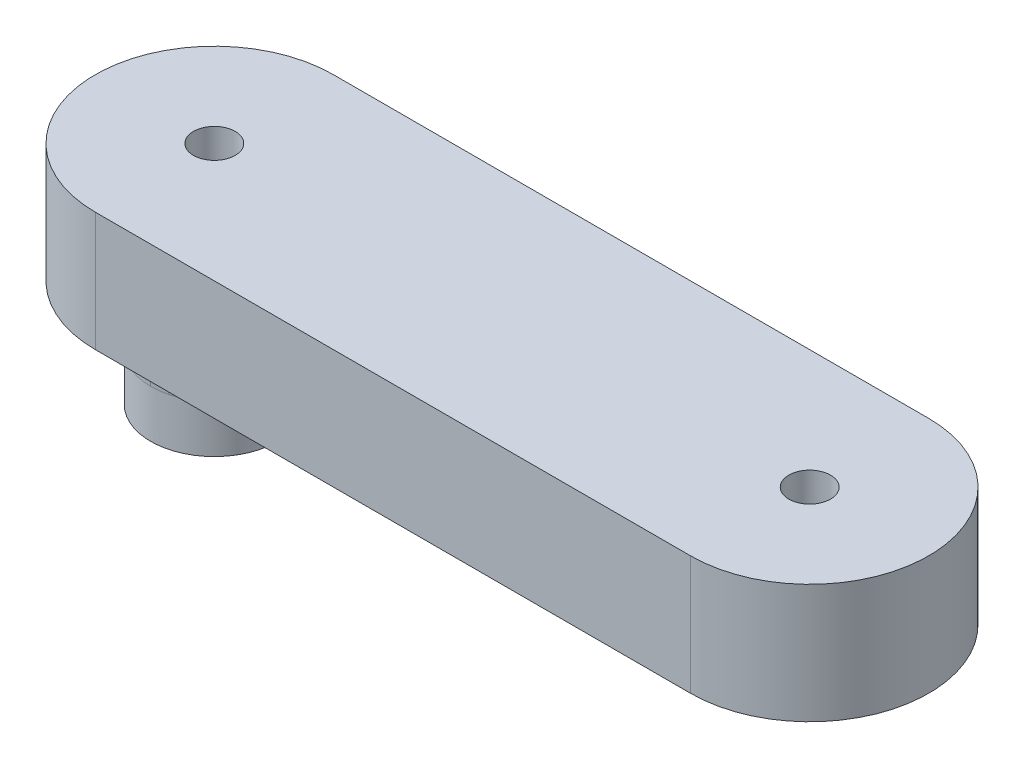
ISO-10303-21;
HEADER;
FILE_DESCRIPTION(('STEP AP214'),'2;1');
FILE_NAME('part.step','',(''),(''),'','','');
FILE_SCHEMA(('AUTOMOTIVE_DESIGN { 1 0 10303 214 1 1 1 1 }'));
ENDSEC;
DATA;
#1=APPLICATION_CONTEXT('core data for automotive mechanical design processes');
#2=APPLICATION_PROTOCOL_DEFINITION('international standard','automotive_design',2000,#1);
#3=PRODUCT_CONTEXT('',#1,'mechanical');
#4=PRODUCT('Part','Part','',(#3));
#5=PRODUCT_RELATED_PRODUCT_CATEGORY('part','',(#4));
#6=PRODUCT_DEFINITION_FORMATION('','',#4);
#7=PRODUCT_DEFINITION_CONTEXT('part definition',#1,'design');
#8=PRODUCT_DEFINITION('design','',#6,#7);
#9=PRODUCT_DEFINITION_SHAPE('','',#8);
#10=(LENGTH_UNIT() NAMED_UNIT(*) SI_UNIT(.MILLI.,.METRE.));
#11=(NAMED_UNIT(*) PLANE_ANGLE_UNIT() SI_UNIT($,.RADIAN.));
#12=(NAMED_UNIT(*) SI_UNIT($,.STERADIAN.) SOLID_ANGLE_UNIT());
#13=UNCERTAINTY_MEASURE_WITH_UNIT(LENGTH_MEASURE(1.E-05),#10,'distance_accuracy_value','');
#14=(GEOMETRIC_REPRESENTATION_CONTEXT(3) GLOBAL_UNCERTAINTY_ASSIGNED_CONTEXT((#13)) GLOBAL_UNIT_ASSIGNED_CONTEXT((#10,
#11,#12)) REPRESENTATION_CONTEXT('',''));
#15=CARTESIAN_POINT('',(0.,0.,0.));
#16=DIRECTION('',(0.,0.,1.));
#17=DIRECTION('',(1.,0.,0.));
#18=AXIS2_PLACEMENT_3D('',#15,#16,#17);
#19=CARTESIAN_POINT('',(-25.,10.,0.));
#20=DIRECTION('',(0.,-1.,0.));
#21=DIRECTION('',(0.,0.,-1.));
#22=AXIS2_PLACEMENT_3D('',#19,#20,#21);
#23=CYLINDRICAL_SURFACE('',#22,10.);
#24=CARTESIAN_POINT('',(-25.,0.,0.));
#25=DIRECTION('',(0.,1.,0.));
#26=DIRECTION('',(0.,0.,1.));
#27=AXIS2_PLACEMENT_3D('',#24,#25,#26);
#28=CIRCLE('',#27,10.);
#29=CARTESIAN_POINT('',(-25.,0.,-10.));
#30=VERTEX_POINT('',#29);
#31=CARTESIAN_POINT('',(-25.,0.,10.));
#32=VERTEX_POINT('',#31);
#33=EDGE_CURVE('E141',#30,#32,#28,.T.);
#34=ORIENTED_EDGE('',*,*,#33,.T.);
#35=DIRECTION('',(0.,-1.,0.));
#36=VECTOR('',#35,1.);
#37=CARTESIAN_POINT('',(-25.,10.,10.));
#38=LINE('',#37,#36);
#39=CARTESIAN_POINT('',(-25.,10.,10.));
#40=VERTEX_POINT('',#39);
#41=EDGE_CURVE('E120',#40,#32,#38,.T.);
#42=ORIENTED_EDGE('',*,*,#41,.F.);
#43=CARTESIAN_POINT('',(-25.,10.,0.));
#44=DIRECTION('',(0.,1.,0.));
#45=DIRECTION('',(0.,0.,1.));
#46=AXIS2_PLACEMENT_3D('',#43,#44,#45);
#47=CIRCLE('',#46,10.);
#48=CARTESIAN_POINT('',(-25.,10.,-10.));
#49=VERTEX_POINT('',#48);
#50=EDGE_CURVE('E128',#49,#40,#47,.T.);
#51=ORIENTED_EDGE('',*,*,#50,.F.);
#52=DIRECTION('',(0.,-1.,0.));
#53=VECTOR('',#52,1.);
#54=CARTESIAN_POINT('',(-25.,10.,-10.));
#55=LINE('',#54,#53);
#56=EDGE_CURVE('E254',#49,#30,#55,.T.);
#57=ORIENTED_EDGE('',*,*,#56,.T.);
#58=EDGE_LOOP('',(#34,#42,#51,#57));
#59=FACE_BOUND('',#58,.T.);
#60=ADVANCED_FACE('F49',(#59),#23,.T.);
#61=CARTESIAN_POINT('',(-25.,10.,10.));
#62=DIRECTION('',(0.,0.,-1.));
#63=DIRECTION('',(-1.,0.,0.));
#64=AXIS2_PLACEMENT_3D('',#61,#62,#63);
#65=PLANE('',#64);
#66=DIRECTION('',(1.,0.,0.));
#67=VECTOR('',#66,1.);
#68=CARTESIAN_POINT('',(-25.,0.,10.));
#69=LINE('',#68,#67);
#70=CARTESIAN_POINT('',(-22.3311987709835,0.,10.));
#71=VERTEX_POINT('',#70);
#72=EDGE_CURVE('E250',#32,#71,#69,.T.);
#73=ORIENTED_EDGE('',*,*,#72,.T.);
#74=CARTESIAN_POINT('',(25.,0.,9.99999999999999));
#75=VERTEX_POINT('',#74);
#76=EDGE_CURVE('E268',#71,#75,#69,.T.);
#77=ORIENTED_EDGE('',*,*,#76,.T.);
#78=DIRECTION('',(0.,-1.,0.));
#79=VECTOR('',#78,1.);
#80=CARTESIAN_POINT('',(25.,10.,9.99999999999999));
#81=LINE('',#80,#79);
#82=CARTESIAN_POINT('',(25.,10.,9.99999999999999));
#83=VERTEX_POINT('',#82);
#84=EDGE_CURVE('E123',#83,#75,#81,.T.);
#85=ORIENTED_EDGE('',*,*,#84,.F.);
#86=DIRECTION('',(1.,0.,0.));
#87=VECTOR('',#86,1.);
#88=CARTESIAN_POINT('',(-25.,10.,10.));
#89=LINE('',#88,#87);
#90=EDGE_CURVE('E115',#40,#83,#89,.T.);
#91=ORIENTED_EDGE('',*,*,#90,.F.);
#92=ORIENTED_EDGE('',*,*,#41,.T.);
#93=EDGE_LOOP('',(#73,#77,#85,#91,#92));
#94=FACE_BOUND('',#93,.T.);
#95=ADVANCED_FACE('F118',(#94),#65,.F.);
#96=CARTESIAN_POINT('',(25.,10.,0.));
#97=DIRECTION('',(0.,-1.,0.));
#98=DIRECTION('',(0.,0.,-1.));
#99=AXIS2_PLACEMENT_3D('',#96,#97,#98);
#100=CYLINDRICAL_SURFACE('',#99,10.);
#101=CARTESIAN_POINT('',(25.,0.,0.));
#102=DIRECTION('',(0.,1.,0.));
#103=DIRECTION('',(0.,0.,1.));
#104=AXIS2_PLACEMENT_3D('',#101,#102,#103);
#105=CIRCLE('',#104,10.);
#106=CARTESIAN_POINT('',(25.,0.,-10.));
#107=VERTEX_POINT('',#106);
#108=EDGE_CURVE('E246',#75,#107,#105,.T.);
#109=ORIENTED_EDGE('',*,*,#108,.T.);
#110=DIRECTION('',(0.,-1.,0.));
#111=VECTOR('',#110,1.);
#112=CARTESIAN_POINT('',(25.,10.,-10.));
#113=LINE('',#112,#111);
#114=CARTESIAN_POINT('',(25.,10.,-10.));
#115=VERTEX_POINT('',#114);
#116=EDGE_CURVE('E149',#115,#107,#113,.T.);
#117=ORIENTED_EDGE('',*,*,#116,.F.);
#118=CARTESIAN_POINT('',(25.,10.,0.));
#119=DIRECTION('',(0.,1.,0.));
#120=DIRECTION('',(0.,0.,1.));
#121=AXIS2_PLACEMENT_3D('',#118,#119,#120);
#122=CIRCLE('',#121,10.);
#123=EDGE_CURVE('E127',#83,#115,#122,.T.);
#124=ORIENTED_EDGE('',*,*,#123,.F.);
#125=ORIENTED_EDGE('',*,*,#84,.T.);
#126=EDGE_LOOP('',(#109,#117,#124,#125));
#127=FACE_BOUND('',#126,.T.);
#128=ADVANCED_FACE('F232',(#127),#100,.T.);
#129=CARTESIAN_POINT('',(-25.,10.,-10.));
#130=DIRECTION('',(0.,0.,1.));
#131=DIRECTION('',(1.,0.,0.));
#132=AXIS2_PLACEMENT_3D('',#129,#130,#131);
#133=PLANE('',#132);
#134=DIRECTION('',(-1.,0.,0.));
#135=VECTOR('',#134,1.);
#136=CARTESIAN_POINT('',(-25.,0.,-10.));
#137=LINE('',#136,#135);
#138=CARTESIAN_POINT('',(-22.3311987709835,0.,-10.));
#139=VERTEX_POINT('',#138);
#140=EDGE_CURVE('E138',#107,#139,#137,.T.);
#141=ORIENTED_EDGE('',*,*,#140,.T.);
#142=EDGE_CURVE('E249',#139,#30,#137,.T.);
#143=ORIENTED_EDGE('',*,*,#142,.T.);
#144=ORIENTED_EDGE('',*,*,#56,.F.);
#145=DIRECTION('',(-1.,0.,0.));
#146=VECTOR('',#145,1.);
#147=CARTESIAN_POINT('',(-25.,10.,-10.));
#148=LINE('',#147,#146);
#149=EDGE_CURVE('E133',#115,#49,#148,.T.);
#150=ORIENTED_EDGE('',*,*,#149,.F.);
#151=ORIENTED_EDGE('',*,*,#116,.T.);
#152=EDGE_LOOP('',(#141,#143,#144,#150,#151));
#153=FACE_BOUND('',#152,.T.);
#154=ADVANCED_FACE('F190',(#153),#133,.F.);
#155=CARTESIAN_POINT('',(-25.,10.,0.));
#156=DIRECTION('',(0.,1.,0.));
#157=DIRECTION('',(0.,0.,1.));
#158=AXIS2_PLACEMENT_3D('',#155,#156,#157);
#159=PLANE('',#158);
#160=CARTESIAN_POINT('',(-25.,10.,0.));
#161=DIRECTION('',(0.,1.,0.));
#162=DIRECTION('',(0.,0.,1.));
#163=AXIS2_PLACEMENT_3D('',#160,#161,#162);
#164=CIRCLE('',#163,1.75);
#165=CARTESIAN_POINT('',(-25.,10.,1.75));
#166=VERTEX_POINT('',#165);
#167=EDGE_CURVE('E290',#166,#166,#164,.F.);
#168=ORIENTED_EDGE('',*,*,#167,.T.);
#169=EDGE_LOOP('',(#168));
#170=FACE_BOUND('',#169,.T.);
#171=CARTESIAN_POINT('',(25.,10.,0.));
#172=DIRECTION('',(0.,1.,0.));
#173=DIRECTION('',(0.,0.,1.));
#174=AXIS2_PLACEMENT_3D('',#171,#172,#173);
#175=CIRCLE('',#174,1.75);
#176=CARTESIAN_POINT('',(25.,10.,1.74999999999999));
#177=VERTEX_POINT('',#176);
#178=EDGE_CURVE('E275',#177,#177,#175,.T.);
#179=ORIENTED_EDGE('',*,*,#178,.F.);
#180=EDGE_LOOP('',(#179));
#181=FACE_BOUND('',#180,.T.);
#182=ORIENTED_EDGE('',*,*,#50,.T.);
#183=ORIENTED_EDGE('',*,*,#90,.T.);
#184=ORIENTED_EDGE('',*,*,#123,.T.);
#185=ORIENTED_EDGE('',*,*,#149,.T.);
#186=EDGE_LOOP('',(#182,#183,#184,#185));
#187=FACE_BOUND('',#186,.T.);
#188=ADVANCED_FACE('F131',(#170,#181,#187),#159,.T.);
#189=CARTESIAN_POINT('',(-25.,0.,0.));
#190=DIRECTION('',(0.,1.,0.));
#191=DIRECTION('',(0.,0.,1.));
#192=AXIS2_PLACEMENT_3D('',#189,#190,#191);
#193=PLANE('',#192);
#194=CARTESIAN_POINT('',(25.,0.,0.));
#195=DIRECTION('',(0.,1.,0.));
#196=DIRECTION('',(0.,0.,1.));
#197=AXIS2_PLACEMENT_3D('',#194,#195,#196);
#198=CIRCLE('',#197,1.75);
#199=CARTESIAN_POINT('',(25.,0.,1.74999999999999));
#200=VERTEX_POINT('',#199);
#201=EDGE_CURVE('E269',#200,#200,#198,.F.);
#202=ORIENTED_EDGE('',*,*,#201,.F.);
#203=EDGE_LOOP('',(#202));
#204=FACE_BOUND('',#203,.T.);
#205=ORIENTED_EDGE('',*,*,#76,.F.);
#206=CARTESIAN_POINT('',(-25.,0.,0.));
#207=DIRECTION('',(0.,1.,0.));
#208=DIRECTION('',(0.,0.,1.));
#209=AXIS2_PLACEMENT_3D('',#206,#207,#208);
#210=CIRCLE('',#209,10.35);
#211=EDGE_CURVE('E11',#71,#139,#210,.T.);
#212=ORIENTED_EDGE('',*,*,#211,.T.);
#213=ORIENTED_EDGE('',*,*,#140,.F.);
#214=ORIENTED_EDGE('',*,*,#108,.F.);
#215=EDGE_LOOP('',(#205,#212,#213,#214));
#216=FACE_BOUND('',#215,.T.);
#217=ADVANCED_FACE('F187',(#204,#216),#193,.F.);
#218=CARTESIAN_POINT('',(25.,-0.000999999999999265,0.));
#219=DIRECTION('',(0.,1.,0.));
#220=DIRECTION('',(0.,0.,1.));
#221=AXIS2_PLACEMENT_3D('',#218,#219,#220);
#222=CYLINDRICAL_SURFACE('',#221,1.75);
#223=ORIENTED_EDGE('',*,*,#178,.T.);
#224=EDGE_LOOP('',(#223));
#225=FACE_BOUND('',#224,.T.);
#226=ORIENTED_EDGE('',*,*,#201,.T.);
#227=EDGE_LOOP('',(#226));
#228=FACE_BOUND('',#227,.T.);
#229=ADVANCED_FACE('F308',(#225,#228),#222,.F.);
#230=CARTESIAN_POINT('',(-25.,-9.,0.));
#231=DIRECTION('',(0.,1.,0.));
#232=DIRECTION('',(0.,0.,1.));
#233=AXIS2_PLACEMENT_3D('',#230,#231,#232);
#234=CYLINDRICAL_SURFACE('',#233,5.35);
#235=CARTESIAN_POINT('',(-25.,-5.,0.));
#236=DIRECTION('',(0.,1.,0.));
#237=DIRECTION('',(0.,0.,1.));
#238=AXIS2_PLACEMENT_3D('',#235,#236,#237);
#239=CIRCLE('',#238,5.35);
#240=CARTESIAN_POINT('',(-23.6204747270301,-5.,-5.16908212560387));
#241=VERTEX_POINT('',#240);
#242=CARTESIAN_POINT('',(-23.6204747270301,-5.,5.16908212560387));
#243=VERTEX_POINT('',#242);
#244=EDGE_CURVE('E143',#241,#243,#239,.F.);
#245=ORIENTED_EDGE('',*,*,#244,.T.);
#246=CARTESIAN_POINT('',(-22.4063247817949,-4.90937934062816,4.67924661270043));
#247=CARTESIAN_POINT('',(-22.8879748506339,0.975498043250479,4.94622203647995));
#248=CARTESIAN_POINT('',(-19.982329250762,0.,10.));
#249=CARTESIAN_POINT('',(-22.468087902895,-4.92215702125141,4.7134828290892));
#250=CARTESIAN_POINT('',(-22.9020255513305,0.90527144246055,4.9457728156593));
#251=CARTESIAN_POINT('',(-20.1018149149591,0.,10.));
#252=CARTESIAN_POINT('',(-22.5305936384705,-4.93311468699,4.74652914754896));
#253=CARTESIAN_POINT('',(-22.9210674061778,0.837164866416158,4.94901573193148));
#254=CARTESIAN_POINT('',(-20.2227372258345,0.,10.));
#255=CARTESIAN_POINT('',(-22.6569545492993,-4.95194389528001,4.81016000486057));
#256=CARTESIAN_POINT('',(-22.9683167428165,0.706727456995853,4.96116416599632));
#257=CARTESIAN_POINT('',(-20.4671924458317,0.,10.));
#258=CARTESIAN_POINT('',(-22.7208094807857,-4.95981599037782,4.84074498369482));
#259=CARTESIAN_POINT('',(-22.996430695619,0.644290788526217,4.97000691203827));
#260=CARTESIAN_POINT('',(-20.5907248833673,0.,10.));
#261=CARTESIAN_POINT('',(-22.914101894452,-4.9796272877734,4.92864537441296));
#262=CARTESIAN_POINT('',(-23.0928174155575,0.467291109513011,5.00221179667532));
#263=CARTESIAN_POINT('',(-20.9646644125965,0.,10.));
#264=CARTESIAN_POINT('',(-23.045388346509,-4.9877843263485,4.98217352822328));
#265=CARTESIAN_POINT('',(-23.1738131629906,0.36035783012853,5.03140402812189));
#266=CARTESIAN_POINT('',(-21.218648483424,0.,10.));
#267=CARTESIAN_POINT('',(-23.3085469853189,-4.99768796878871,5.07745985956556));
#268=CARTESIAN_POINT('',(-23.3603007018644,0.174145036372328,5.09358181809736));
#269=CARTESIAN_POINT('',(-21.7277497753456,0.,10.));
#270=CARTESIAN_POINT('',(-23.4403256872486,-4.99958701406536,5.11947470033271));
#271=CARTESIAN_POINT('',(-23.4649516265539,0.0935749025152531,5.1264658155242));
#272=CARTESIAN_POINT('',(-21.9826861426236,0.,10.));
#273=CARTESIAN_POINT('',(-23.7067656944101,-5.00029124399043,5.19318317312786));
#274=CARTESIAN_POINT('',(-23.6933077655576,-0.0448370798064056,5.18928403448164));
#275=CARTESIAN_POINT('',(-22.4981355022677,0.,10.));
#276=CARTESIAN_POINT('',(-23.8414274910527,-4.99909589698226,5.22487503048074));
#277=CARTESIAN_POINT('',(-23.8171590642594,-0.103227899936856,5.21936847159637));
#278=CARTESIAN_POINT('',(-22.7586494453069,0.,10.));
#279=CARTESIAN_POINT('',(-24.1153230647331,-4.99581213660066,5.27822633599849));
#280=CARTESIAN_POINT('',(-24.0802845511431,-0.199835553334219,5.27218728131988));
#281=CARTESIAN_POINT('',(-23.2885221906525,0.,10.));
#282=CARTESIAN_POINT('',(-24.2545952926233,-4.99370752498329,5.29968820730515));
#283=CARTESIAN_POINT('',(-24.2202075943135,-0.238070156897069,5.29496276846834));
#284=CARTESIAN_POINT('',(-23.5579553791874,0.,10.));
#285=CARTESIAN_POINT('',(-24.5343909129845,-4.99020537825828,5.33156033600395));
#286=CARTESIAN_POINT('',(-24.5075631984335,-0.294212329057783,5.3293078754699));
#287=CARTESIAN_POINT('',(-24.0992422335306,0.,10.));
#288=CARTESIAN_POINT('',(-24.6749142592356,-4.98880781713959,5.34197099996452));
#289=CARTESIAN_POINT('',(-24.6555353138538,-0.312355351759313,5.34101420045178));
#290=CARTESIAN_POINT('',(-24.371095809923,0.,10.));
#291=CARTESIAN_POINT('',(-24.9599527315156,-4.98750073565178,5.35179776405821));
#292=CARTESIAN_POINT('',(-24.9571017441589,-0.329418746312639,5.35199488366776));
#293=CARTESIAN_POINT('',(-24.9225253777918,0.,10.));
#294=CARTESIAN_POINT('',(-25.1044783247979,-4.98763004344253,5.35092692281945));
#295=CARTESIAN_POINT('',(-25.111405781805,-0.327912126433172,5.35099298670278));
#296=CARTESIAN_POINT('',(-25.2021216190016,0.,10.));
#297=CARTESIAN_POINT('',(-25.320833368275,-4.98894637096785,5.340860003256));
#298=CARTESIAN_POINT('',(-25.3396172782977,-0.310420525479363,5.33979122345231));
#299=CARTESIAN_POINT('',(-25.620677637691,0.,10.));
#300=CARTESIAN_POINT('',(-25.3928925362841,-4.98957242342615,5.33604258314774));
#301=CARTESIAN_POINT('',(-25.4153552384296,-0.302025929414769,5.33442455139388));
#302=CARTESIAN_POINT('',(-25.7600818225309,0.,10.));
#303=CARTESIAN_POINT('',(-25.5367558026473,-4.99108186619892,5.32349558536303));
#304=CARTESIAN_POINT('',(-25.5651430873869,-0.280067579465135,5.3206780454283));
#305=CARTESIAN_POINT('',(-26.0383967397009,0.,10.));
#306=CARTESIAN_POINT('',(-25.6085599023708,-4.99196525512985,5.31576602334332));
#307=CARTESIAN_POINT('',(-25.6392701624221,-0.266479800947126,5.31228369439717));
#308=CARTESIAN_POINT('',(-26.1773074746799,0.,10.));
#309=CARTESIAN_POINT('',(-25.6801859681807,-4.99291881518917,5.3065852531256));
#310=CARTESIAN_POINT('',(-25.7120499996823,-0.250271465370146,5.30250099440117));
#311=CARTESIAN_POINT('',(-26.3158737889103,0.,10.));
#312=(BOUNDED_SURFACE() B_SPLINE_SURFACE(3,2,((#246,#247,#248),(#249,#250,#251),(#252,#253,
#254),(#255,#256,#257),(#258,#259,#260),(#261,#262,#263),(#264,#265,#266),(#267,#268,#269),
(#270,#271,#272),(#273,#274,#275),(#276,#277,#278),(#279,#280,#281),(#282,#283,#284),(#285,#286,
#287),(#288,#289,#290),(#291,#292,#293),(#294,#295,#296),(#297,#298,#299),(#300,#301,#302),
(#303,#304,#305),(#306,#307,#308),(#309,#310,#311)),.UNSPECIFIED.,.F.,.F.,
.F.) B_SPLINE_SURFACE_WITH_KNOTS((4,2,2,2,2,2,2,2,2,2,4),(3,3),(0.,0.411542741492993,
0.823011752553321,1.645144449525,2.44709631854861,3.24918598240891,4.06619522460137,
4.88317440838842,5.72097312572852,6.14002468851432,6.55907399835985),(0.,1.),
.UNSPECIFIED.) GEOMETRIC_REPRESENTATION_ITEM() RATIONAL_B_SPLINE_SURFACE(((1.,0.645846913338497,
1.),(1.,0.649862634729996,1.),(1.,0.653798780730085,1.),(1.,0.661474206336515,1.),(1.,
0.665213521086353,1.),(1.,0.676074699999644,1.),(1.,0.682847801331046,1.),(1.,0.695078749137499,
1.),(1.,0.700564799930277,1.),(1.,0.710281907038307,1.),(1.,0.714512747553014,1.),(1.,
0.721677506720577,1.),(1.,0.724585837636818,1.),(1.,0.728916944876098,1.),(1.,0.730339775849909,
1.),(1.,0.731682421614335,1.),(1.,0.731563010207267,1.),(1.,0.730188276238598,1.),(1.,
0.72953053405369,1.),(1.,0.727821334129289,1.),(1.,0.726769878506541,1.),(1.,0.725524091352782,1.))) REPRESENTATION_ITEM('') SURFACE());
#313=CARTESIAN_POINT('',(-22.4063247817949,-4.90937934062816,4.67924661270043));
#314=CARTESIAN_POINT('',(-22.468087902895,-4.92215702125141,4.7134828290892));
#315=CARTESIAN_POINT('',(-22.5305936384705,-4.93311468699,4.74652914754896));
#316=CARTESIAN_POINT('',(-22.6569545492993,-4.95194389528001,4.81016000486057));
#317=CARTESIAN_POINT('',(-22.7208094807857,-4.95981599037782,4.84074498369482));
#318=CARTESIAN_POINT('',(-22.914101894452,-4.9796272877734,4.92864537441296));
#319=CARTESIAN_POINT('',(-23.045388346509,-4.9877843263485,4.98217352822328));
#320=CARTESIAN_POINT('',(-23.3085469853189,-4.99768796878871,5.07745985956556));
#321=CARTESIAN_POINT('',(-23.4403256872486,-4.99958701406536,5.11947470033271));
#322=CARTESIAN_POINT('',(-23.7067656944101,-5.00029124399043,5.19318317312786));
#323=CARTESIAN_POINT('',(-23.8414274910527,-4.99909589698226,5.22487503048074));
#324=CARTESIAN_POINT('',(-24.1153230647331,-4.99581213660066,5.27822633599849));
#325=CARTESIAN_POINT('',(-24.2545952926234,-4.99370752498329,5.29968820730515));
#326=CARTESIAN_POINT('',(-24.5343909129845,-4.99020537825828,5.33156033600395));
#327=CARTESIAN_POINT('',(-24.6749142592356,-4.98880781713959,5.34197099996452));
#328=CARTESIAN_POINT('',(-24.9599527315156,-4.98750073565178,5.35179776405821));
#329=CARTESIAN_POINT('',(-25.1044783247979,-4.98763004344254,5.35092692281945));
#330=CARTESIAN_POINT('',(-25.320833368275,-4.98894637096785,5.340860003256));
#331=CARTESIAN_POINT('',(-25.3928925362841,-4.98957242342615,5.33604258314774));
#332=CARTESIAN_POINT('',(-25.5367558026473,-4.99108186619892,5.32349558536303));
#333=CARTESIAN_POINT('',(-25.6085599023708,-4.99196525512985,5.31576602334332));
#334=CARTESIAN_POINT('',(-25.6801859681807,-4.99291881518917,5.3065852531256));
#335=B_SPLINE_CURVE_WITH_KNOTS('',3,(#313,#314,#315,#316,#317,#318,#319,#320,#321,#322,#323,
#324,#325,#326,#327,#328,#329,#330,#331,#332,#333,#334),.UNSPECIFIED.,.F.,.F.,(4,2,2,2,2,2,2,2,
2,2,4),(0.,0.411542741492993,0.823011752553321,1.645144449525,2.44709631854861,3.24918598240891,
4.06619522460137,4.88317440838842,5.72097312572852,6.14002468851432,6.55907399835985),.UNSPECIFIED.);
#336=CARTESIAN_POINT('',(-25.,-4.98773495687171,5.35));
#337=VERTEX_POINT('',#336);
#338=EDGE_CURVE('E63',#243,#337,#335,.T.);
#339=ORIENTED_EDGE('',*,*,#338,.T.);
#340=CARTESIAN_POINT('',(-25.,-4.98773495687171,0.));
#341=DIRECTION('',(0.,1.,0.));
#342=DIRECTION('',(0.,0.,1.));
#343=AXIS2_PLACEMENT_3D('',#340,#341,#342);
#344=CIRCLE('',#343,5.35);
#345=CARTESIAN_POINT('',(-25.,-4.98773495687171,-5.35));
#346=VERTEX_POINT('',#345);
#347=EDGE_CURVE('E161',#337,#346,#344,.F.);
#348=ORIENTED_EDGE('',*,*,#347,.T.);
#349=CARTESIAN_POINT('',(-26.0228866606093,-4.99746914629356,-5.25130487398585));
#350=CARTESIAN_POINT('',(-26.0518342041425,-0.151327584497428,-5.24566626475481));
#351=CARTESIAN_POINT('',(-26.9788555023003,0.,-10.));
#352=CARTESIAN_POINT('',(-25.9519816330296,-4.99661173471191,-5.26511615605325));
#353=CARTESIAN_POINT('',(-25.9838925193806,-0.176275219698127,-5.25932344975122));
#354=CARTESIAN_POINT('',(-26.8416840938048,0.,-10.));
#355=CARTESIAN_POINT('',(-25.8808053789332,-4.9956432876798,-5.27748969279492));
#356=CARTESIAN_POINT('',(-25.9139269500573,-0.198492678012398,-5.27196649699026));
#357=CARTESIAN_POINT('',(-26.703987976067,0.,-10.));
#358=CARTESIAN_POINT('',(-25.7380099362557,-4.99369141658507,-5.29934522958744));
#359=CARTESIAN_POINT('',(-25.7712171581687,-0.23745274121478,-5.29471475920545));
#360=CARTESIAN_POINT('',(-26.4277388486444,0.,-10.));
#361=CARTESIAN_POINT('',(-25.6663907450769,-4.99270799243456,-5.30882721266284));
#362=CARTESIAN_POINT('',(-25.6984091257832,-0.254238109499981,-5.30484226443355));
#363=CARTESIAN_POINT('',(-26.2891858339339,0.,-10.));
#364=CARTESIAN_POINT('',(-25.4510695281324,-4.99004653847853,-5.33290592711733));
#365=CARTESIAN_POINT('',(-25.4773319962797,-0.296564774639448,-5.33077347696277));
#366=CARTESIAN_POINT('',(-25.8726298347986,0.,-10.));
#367=CARTESIAN_POINT('',(-25.3068541100363,-4.98865643752529,-5.34314510868886));
#368=CARTESIAN_POINT('',(-25.3252574445491,-0.314398026885511,-5.34231726020473));
#369=CARTESIAN_POINT('',(-25.5936336521263,0.,-10.));
#370=CARTESIAN_POINT('',(-25.0217769295541,-4.98749388985973,-5.35180766924487));
#371=CARTESIAN_POINT('',(-25.0234398128161,-0.329434998305688,-5.35201856702636));
#372=CARTESIAN_POINT('',(-25.0421292001654,0.,-10.));
#373=CARTESIAN_POINT('',(-24.880923678495,-4.98768099912332,-5.35052640691505));
#374=CARTESIAN_POINT('',(-24.8731180834523,-0.327217293838509,-5.35055142617128));
#375=CARTESIAN_POINT('',(-24.7696373967144,0.,-10.));
#376=CARTESIAN_POINT('',(-24.5997502113895,-4.989470825283,-5.33686337690267));
#377=CARTESIAN_POINT('',(-24.576495502657,-0.303458308736668,-5.33532802825332));
#378=CARTESIAN_POINT('',(-24.2256849883891,0.,-10.));
#379=CARTESIAN_POINT('',(-24.4594300192166,-4.9910736048473,-5.3244811178061));
#380=CARTESIAN_POINT('',(-24.4295879130414,-0.281817197515283,-5.32150804622998));
#381=CARTESIAN_POINT('',(-23.9542244296997,0.,-10.));
#382=CARTESIAN_POINT('',(-24.1727564785887,-4.99486237568772,-5.28773553453734));
#383=CARTESIAN_POINT('',(-24.1377340144726,-0.216815216529236,-5.28234281094893));
#384=CARTESIAN_POINT('',(-23.3996316922226,0.,-10.));
#385=CARTESIAN_POINT('',(-24.0264801992908,-4.99707489892725,-5.2627687936572));
#386=CARTESIAN_POINT('',(-23.9927750299324,-0.172067422348057,-5.256259441982));
#387=CARTESIAN_POINT('',(-23.1166486098414,0.,-10.));
#388=CARTESIAN_POINT('',(-23.7365131495399,-4.99998286469731,-5.20077750969058));
#389=CARTESIAN_POINT('',(-23.7201965933415,-0.0589137193665749,-5.19658457594004));
#390=CARTESIAN_POINT('',(-22.5556843173357,0.,-10.));
#391=CARTESIAN_POINT('',(-23.5928222981303,-5.00067835481242,-5.16375334484967));
#392=CARTESIAN_POINT('',(-23.5921846311864,0.0100164515104532,-5.16277477656473));
#393=CARTESIAN_POINT('',(-22.2777029505943,0.,-10.));
#394=CARTESIAN_POINT('',(-23.3050421814323,-4.99753497146377,-5.0766944689985));
#395=CARTESIAN_POINT('',(-23.3571871109459,0.175551584476233,-5.09328951321567));
#396=CARTESIAN_POINT('',(-21.720969453793,0.,-10.));
#397=CARTESIAN_POINT('',(-23.1610529765808,-4.99356945320689,-5.02632655407054));
#398=CARTESIAN_POINT('',(-23.2508597913106,0.27363499352601,-5.05743919766299));
#399=CARTESIAN_POINT('',(-21.4424108985969,0.,-10.));
#400=CARTESIAN_POINT('',(-22.9487727428786,-4.98091755986846,-4.94173859701555));
#401=CARTESIAN_POINT('',(-23.1172209488664,0.440573720836214,-5.01123762346318));
#402=CARTESIAN_POINT('',(-21.031737923125,0.,-10.));
#403=CARTESIAN_POINT('',(-22.8786048878471,-4.97557980590995,-4.91202404726421));
#404=CARTESIAN_POINT('',(-23.0766921001863,0.500169151962237,-4.99699131325034));
#405=CARTESIAN_POINT('',(-20.8959926334928,0.,-10.));
#406=CARTESIAN_POINT('',(-22.7396529259375,-4.96203528700234,-4.84965282784347));
#407=CARTESIAN_POINT('',(-23.0050059401995,0.626198699088739,-4.97275664154473));
#408=CARTESIAN_POINT('',(-20.6271790249498,0.,-10.));
#409=CARTESIAN_POINT('',(-22.6708690311674,-4.95382808576641,-4.81699571133053));
#410=CARTESIAN_POINT('',(-22.9739300041018,0.692765411267942,-4.96280867491815));
#411=CARTESIAN_POINT('',(-20.4941111163786,0.,-10.));
#412=CARTESIAN_POINT('',(-22.6028528619615,-4.94387071662594,-4.78290556028382));
#413=CARTESIAN_POINT('',(-22.9482532363106,0.762217639042707,-4.95601696890614));
#414=CARTESIAN_POINT('',(-20.3625284338882,0.,-10.));
#415=(BOUNDED_SURFACE() B_SPLINE_SURFACE(3,2,((#349,#350,#351),(#352,#353,#354),(#355,#356,
#357),(#358,#359,#360),(#361,#362,#363),(#364,#365,#366),(#367,#368,#369),(#370,#371,#372),
(#373,#374,#375),(#376,#377,#378),(#379,#380,#381),(#382,#383,#384),(#385,#386,#387),(#388,#389,
#390),(#391,#392,#393),(#394,#395,#396),(#397,#398,#399),(#400,#401,#402),(#403,#404,#405),
(#406,#407,#408),(#409,#410,#411),(#412,#413,#414)),.UNSPECIFIED.,.F.,.F.,
.F.) B_SPLINE_SURFACE_WITH_KNOTS((4,2,2,2,2,2,2,2,2,2,4),(3,3),(0.,0.41919544062289,
0.838393342170593,1.67649585344164,2.49317378017277,3.30988786102549,4.17013299968638,
5.03035115475904,5.91449315288708,6.35688857993051,6.7993513005261),(0.,1.),
.UNSPECIFIED.) GEOMETRIC_REPRESENTATION_ITEM() RATIONAL_B_SPLINE_SURFACE(((1.,0.718062116433734,
1.),(1.,0.719917164011899,1.),(1.,0.72158575518807,1.),(1.,0.724540971110069,1.),(1.,
0.725827593613473,1.),(1.,0.72910013465956,1.),(1.,0.730500037216757,1.),(1.,0.73168395531896,
1.),(1.,0.731508363306906,1.),(1.,0.729642437825001,1.),(1.,0.727952037298279,1.),(1.,
0.722966735302251,1.),(1.,0.719591115830581,1.),(1.,0.711296811271779,1.),(1.,0.706378174589809,
1.),(1.,0.694983923227657,1.),(1.,0.688468811289004,1.),(1.,0.677760266484751,1.),(1.,
0.674033234201927,1.),(1.,0.666305585787939,1.),(1.,0.662304928127688,1.),(1.,0.658187012948064,1.))) REPRESENTATION_ITEM('') SURFACE());
#416=CARTESIAN_POINT('',(-26.0228866606093,-4.99746914629356,-5.25130487398585));
#417=CARTESIAN_POINT('',(-25.9519816330296,-4.99661173471191,-5.26511615605325));
#418=CARTESIAN_POINT('',(-25.8808053789332,-4.9956432876798,-5.27748969279492));
#419=CARTESIAN_POINT('',(-25.7380099362557,-4.99369141658507,-5.29934522958744));
#420=CARTESIAN_POINT('',(-25.6663907450769,-4.99270799243456,-5.30882721266284));
#421=CARTESIAN_POINT('',(-25.4510695281324,-4.99004653847853,-5.33290592711733));
#422=CARTESIAN_POINT('',(-25.3068541100363,-4.98865643752529,-5.34314510868886));
#423=CARTESIAN_POINT('',(-25.0217769295541,-4.98749388985973,-5.35180766924487));
#424=CARTESIAN_POINT('',(-24.880923678495,-4.98768099912332,-5.35052640691505));
#425=CARTESIAN_POINT('',(-24.5997502113895,-4.989470825283,-5.33686337690267));
#426=CARTESIAN_POINT('',(-24.4594300192166,-4.9910736048473,-5.3244811178061));
#427=CARTESIAN_POINT('',(-24.1727564785887,-4.99486237568772,-5.28773553453734));
#428=CARTESIAN_POINT('',(-24.0264801992908,-4.99707489892725,-5.2627687936572));
#429=CARTESIAN_POINT('',(-23.7365131495399,-4.99998286469731,-5.20077750969058));
#430=CARTESIAN_POINT('',(-23.5928222981303,-5.00067835481242,-5.16375334484967));
#431=CARTESIAN_POINT('',(-23.3050421814323,-4.99753497146377,-5.0766944689985));
#432=CARTESIAN_POINT('',(-23.1610529765808,-4.99356945320689,-5.02632655407054));
#433=CARTESIAN_POINT('',(-22.9487727428786,-4.98091755986846,-4.94173859701555));
#434=CARTESIAN_POINT('',(-22.8786048878471,-4.97557980590995,-4.91202404726421));
#435=CARTESIAN_POINT('',(-22.7396529259375,-4.96203528700234,-4.84965282784346));
#436=CARTESIAN_POINT('',(-22.6708690311674,-4.95382808576641,-4.81699571133053));
#437=CARTESIAN_POINT('',(-22.6028528619615,-4.94387071662594,-4.78290556028382));
#438=B_SPLINE_CURVE_WITH_KNOTS('',3,(#416,#417,#418,#419,#420,#421,#422,#423,#424,#425,#426,
#427,#428,#429,#430,#431,#432,#433,#434,#435,#436,#437),.UNSPECIFIED.,.F.,.F.,(4,2,2,2,2,2,2,2,
2,2,4),(0.,0.41919544062289,0.838393342170593,1.67649585344164,2.49317378017277,
3.30988786102549,4.17013299968638,5.03035115475904,5.91449315288708,6.35688857993051,
6.7993513005261),.UNSPECIFIED.);
#439=EDGE_CURVE('E147',#346,#241,#438,.T.);
#440=ORIENTED_EDGE('',*,*,#439,.T.);
#441=EDGE_LOOP('',(#245,#339,#348,#440));
#442=FACE_BOUND('',#441,.T.);
#443=CARTESIAN_POINT('',(-25.,-9.,0.));
#444=DIRECTION('',(0.,-1.,0.));
#445=DIRECTION('',(0.,0.,-1.));
#446=AXIS2_PLACEMENT_3D('',#443,#444,#445);
#447=CIRCLE('',#446,5.35);
#448=CARTESIAN_POINT('',(-25.,-9.,-5.35));
#449=VERTEX_POINT('',#448);
#450=EDGE_CURVE('E199',#449,#449,#447,.T.);
#451=ORIENTED_EDGE('',*,*,#450,.F.);
#452=EDGE_LOOP('',(#451));
#453=FACE_BOUND('',#452,.T.);
#454=ADVANCED_FACE('F163',(#442,#453),#234,.T.);
#455=CARTESIAN_POINT('',(-25.,-9.,0.));
#456=DIRECTION('',(0.,-1.,0.));
#457=DIRECTION('',(0.,0.,-1.));
#458=AXIS2_PLACEMENT_3D('',#455,#456,#457);
#459=PLANE('',#458);
#460=CARTESIAN_POINT('',(-25.,-9.,0.));
#461=DIRECTION('',(0.,-1.,0.));
#462=DIRECTION('',(0.,0.,-1.));
#463=AXIS2_PLACEMENT_3D('',#460,#461,#462);
#464=CIRCLE('',#463,1.75);
#465=CARTESIAN_POINT('',(-25.,-9.,-1.75));
#466=VERTEX_POINT('',#465);
#467=EDGE_CURVE('E286',#466,#466,#464,.T.);
#468=ORIENTED_EDGE('',*,*,#467,.F.);
#469=EDGE_LOOP('',(#468));
#470=FACE_BOUND('',#469,.T.);
#471=ORIENTED_EDGE('',*,*,#450,.T.);
#472=EDGE_LOOP('',(#471));
#473=FACE_BOUND('',#472,.T.);
#474=ADVANCED_FACE('F180',(#470,#473),#459,.T.);
#475=CARTESIAN_POINT('',(-25.,-4.98773495687171,-10.35));
#476=DIRECTION('',(-1.,0.,0.));
#477=DIRECTION('',(0.,-1.,0.));
#478=AXIS2_PLACEMENT_3D('',#475,#476,#477);
#479=CIRCLE('',#478,5.);
#480=EDGE_CURVE('E200',#30,#346,#479,.F.);
#481=ORIENTED_EDGE('',*,*,#480,.F.);
#482=ORIENTED_EDGE('',*,*,#142,.F.);
#483=CARTESIAN_POINT('',(-22.3311987709835,-5.,-10.));
#484=DIRECTION('',(-0.966183574879227,0.,-0.257855191209324));
#485=DIRECTION('',(-0.257855191209324,0.,0.966183574879227));
#486=AXIS2_PLACEMENT_3D('',#483,#484,#485);
#487=CIRCLE('',#486,5.);
#488=EDGE_CURVE('E195',#241,#139,#487,.T.);
#489=ORIENTED_EDGE('',*,*,#488,.F.);
#490=ORIENTED_EDGE('',*,*,#439,.F.);
#491=EDGE_LOOP('',(#481,#482,#489,#490));
#492=FACE_BOUND('',#491,.T.);
#493=ADVANCED_FACE('F174',(#492),#415,.F.);
#494=CARTESIAN_POINT('',(-25.,-5.,0.));
#495=DIRECTION('',(0.,1.,0.));
#496=DIRECTION('',(0.,0.,1.));
#497=AXIS2_PLACEMENT_3D('',#494,#495,#496);
#498=TOROIDAL_SURFACE('',#497,10.35,5.);
#499=ORIENTED_EDGE('',*,*,#488,.T.);
#500=ORIENTED_EDGE('',*,*,#211,.F.);
#501=CARTESIAN_POINT('',(-22.3311987709835,-5.,10.));
#502=DIRECTION('',(0.966183574879227,0.,-0.257855191209324));
#503=DIRECTION('',(-0.257855191209324,0.,-0.966183574879227));
#504=AXIS2_PLACEMENT_3D('',#501,#502,#503);
#505=CIRCLE('',#504,5.);
#506=EDGE_CURVE('E71',#243,#71,#505,.T.);
#507=ORIENTED_EDGE('',*,*,#506,.F.);
#508=ORIENTED_EDGE('',*,*,#244,.F.);
#509=EDGE_LOOP('',(#499,#500,#507,#508));
#510=FACE_BOUND('',#509,.T.);
#511=ADVANCED_FACE('F179',(#510),#498,.F.);
#512=CARTESIAN_POINT('',(-25.,-4.98773495687171,0.));
#513=DIRECTION('',(0.,1.,0.));
#514=DIRECTION('',(0.,0.,1.));
#515=AXIS2_PLACEMENT_3D('',#512,#513,#514);
#516=TOROIDAL_SURFACE('',#515,10.35,5.);
#517=ORIENTED_EDGE('',*,*,#480,.T.);
#518=ORIENTED_EDGE('',*,*,#347,.F.);
#519=CARTESIAN_POINT('',(-25.,-4.98773495687171,10.35));
#520=DIRECTION('',(-1.,0.,0.));
#521=DIRECTION('',(0.,0.,1.));
#522=AXIS2_PLACEMENT_3D('',#519,#520,#521);
#523=CIRCLE('',#522,5.);
#524=EDGE_CURVE('E284',#32,#337,#523,.T.);
#525=ORIENTED_EDGE('',*,*,#524,.F.);
#526=ORIENTED_EDGE('',*,*,#33,.F.);
#527=EDGE_LOOP('',(#517,#518,#525,#526));
#528=FACE_BOUND('',#527,.T.);
#529=ADVANCED_FACE('F217',(#528),#516,.F.);
#530=ORIENTED_EDGE('',*,*,#506,.T.);
#531=ORIENTED_EDGE('',*,*,#72,.F.);
#532=ORIENTED_EDGE('',*,*,#524,.T.);
#533=ORIENTED_EDGE('',*,*,#338,.F.);
#534=EDGE_LOOP('',(#530,#531,#532,#533));
#535=FACE_BOUND('',#534,.T.);
#536=ADVANCED_FACE('F219',(#535),#312,.F.);
#537=CARTESIAN_POINT('',(-25.,10.001,0.));
#538=DIRECTION('',(0.,-1.,0.));
#539=DIRECTION('',(0.,0.,-1.));
#540=AXIS2_PLACEMENT_3D('',#537,#538,#539);
#541=CYLINDRICAL_SURFACE('',#540,1.75);
#542=ORIENTED_EDGE('',*,*,#167,.F.);
#543=EDGE_LOOP('',(#542));
#544=FACE_BOUND('',#543,.T.);
#545=ORIENTED_EDGE('',*,*,#467,.T.);
#546=EDGE_LOOP('',(#545));
#547=FACE_BOUND('',#546,.T.);
#548=ADVANCED_FACE('F225',(#544,#547),#541,.F.);
#549=CLOSED_SHELL('',(#60,#95,#128,#154,#188,#217,#229,#454,#474,#493,#511,#529,#536,#548));
#550=MANIFOLD_SOLID_BREP('B2',#549);
#551=ADVANCED_BREP_SHAPE_REPRESENTATION('',(#18,#550),#14);
#552=SHAPE_DEFINITION_REPRESENTATION(#9,#551);
ENDSEC;
END-ISO-10303-21;
